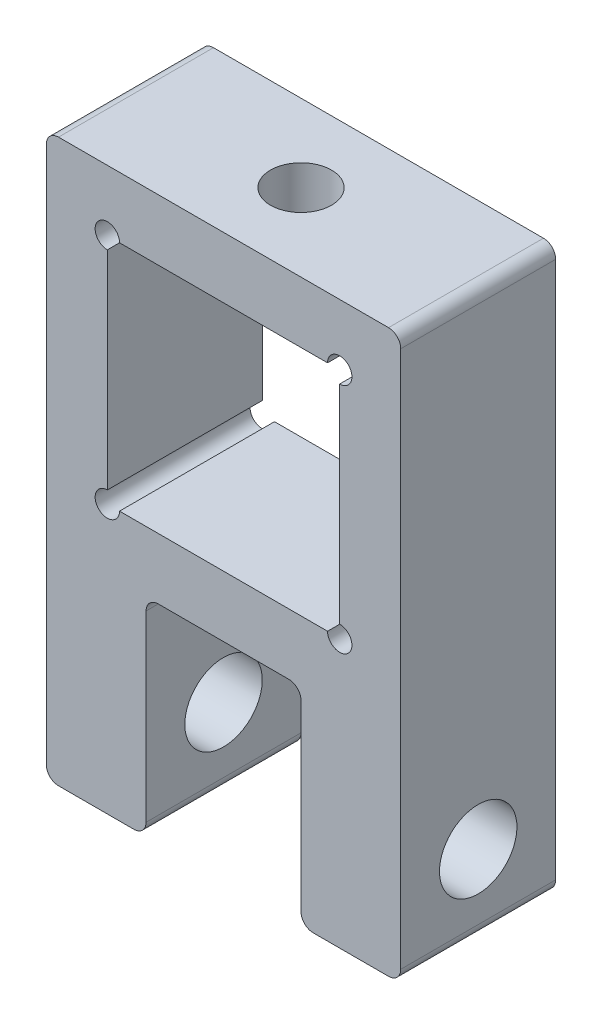
ISO-10303-21;
HEADER;
FILE_DESCRIPTION(('STEP AP214'),'2;1');
FILE_NAME('part.step','',(''),(''),'','','');
FILE_SCHEMA(('AUTOMOTIVE_DESIGN { 1 0 10303 214 1 1 1 1 }'));
ENDSEC;
DATA;
#1=APPLICATION_CONTEXT('core data for automotive mechanical design processes');
#2=APPLICATION_PROTOCOL_DEFINITION('international standard','automotive_design',2000,#1);
#3=PRODUCT_CONTEXT('',#1,'mechanical');
#4=PRODUCT('Part','Part','',(#3));
#5=PRODUCT_RELATED_PRODUCT_CATEGORY('part','',(#4));
#6=PRODUCT_DEFINITION_FORMATION('','',#4);
#7=PRODUCT_DEFINITION_CONTEXT('part definition',#1,'design');
#8=PRODUCT_DEFINITION('design','',#6,#7);
#9=PRODUCT_DEFINITION_SHAPE('','',#8);
#10=(LENGTH_UNIT() NAMED_UNIT(*) SI_UNIT(.MILLI.,.METRE.));
#11=(NAMED_UNIT(*) PLANE_ANGLE_UNIT() SI_UNIT($,.RADIAN.));
#12=(NAMED_UNIT(*) SI_UNIT($,.STERADIAN.) SOLID_ANGLE_UNIT());
#13=UNCERTAINTY_MEASURE_WITH_UNIT(LENGTH_MEASURE(1.E-05),#10,'distance_accuracy_value','');
#14=(GEOMETRIC_REPRESENTATION_CONTEXT(3) GLOBAL_UNCERTAINTY_ASSIGNED_CONTEXT((#13)) GLOBAL_UNIT_ASSIGNED_CONTEXT((#10,
#11,#12)) REPRESENTATION_CONTEXT('',''));
#15=CARTESIAN_POINT('',(0.,0.,0.));
#16=DIRECTION('',(0.,0.,1.));
#17=DIRECTION('',(1.,0.,0.));
#18=AXIS2_PLACEMENT_3D('',#15,#16,#17);
#19=CARTESIAN_POINT('',(-9.525,22.,12.7));
#20=DIRECTION('',(0.,0.,-1.));
#21=DIRECTION('',(-1.,0.,0.));
#22=AXIS2_PLACEMENT_3D('',#19,#20,#21);
#23=CYLINDRICAL_SURFACE('',#22,1.);
#24=CARTESIAN_POINT('',(-9.525,22.,0.));
#25=DIRECTION('',(0.,0.,1.));
#26=DIRECTION('',(1.,0.,0.));
#27=AXIS2_PLACEMENT_3D('',#24,#25,#26);
#28=CIRCLE('',#27,1.);
#29=CARTESIAN_POINT('',(-9.525,23.,0.));
#30=VERTEX_POINT('',#29);
#31=CARTESIAN_POINT('',(-8.525,22.,0.));
#32=VERTEX_POINT('',#31);
#33=EDGE_CURVE('E203',#30,#32,#28,.T.);
#34=ORIENTED_EDGE('',*,*,#33,.F.);
#35=DIRECTION('',(0.,0.,-1.));
#36=VECTOR('',#35,1.);
#37=CARTESIAN_POINT('',(-9.525,23.,12.7));
#38=LINE('',#37,#36);
#39=CARTESIAN_POINT('',(-9.525,23.,12.7));
#40=VERTEX_POINT('',#39);
#41=EDGE_CURVE('E198',#40,#30,#38,.T.);
#42=ORIENTED_EDGE('',*,*,#41,.F.);
#43=CARTESIAN_POINT('',(-9.525,22.,12.7));
#44=DIRECTION('',(0.,0.,1.));
#45=DIRECTION('',(1.,0.,0.));
#46=AXIS2_PLACEMENT_3D('',#43,#44,#45);
#47=CIRCLE('',#46,1.);
#48=CARTESIAN_POINT('',(-8.525,22.,12.7));
#49=VERTEX_POINT('',#48);
#50=EDGE_CURVE('E201',#40,#49,#47,.T.);
#51=ORIENTED_EDGE('',*,*,#50,.T.);
#52=DIRECTION('',(0.,0.,-1.));
#53=VECTOR('',#52,1.);
#54=CARTESIAN_POINT('',(-8.525,22.,12.7));
#55=LINE('',#54,#53);
#56=EDGE_CURVE('E241',#49,#32,#55,.T.);
#57=ORIENTED_EDGE('',*,*,#56,.T.);
#58=EDGE_LOOP('',(#34,#42,#51,#57));
#59=FACE_BOUND('',#58,.T.);
#60=ADVANCED_FACE('F36',(#59),#23,.F.);
#61=CARTESIAN_POINT('',(-9.525,0.,12.7));
#62=DIRECTION('',(-1.,0.,0.));
#63=DIRECTION('',(0.,0.,1.));
#64=AXIS2_PLACEMENT_3D('',#61,#62,#63);
#65=PLANE('',#64);
#66=DIRECTION('',(0.,1.,0.));
#67=VECTOR('',#66,1.);
#68=CARTESIAN_POINT('',(-9.525,0.,0.));
#69=LINE('',#68,#67);
#70=CARTESIAN_POINT('',(-9.525,40.05,0.));
#71=VERTEX_POINT('',#70);
#72=EDGE_CURVE('E268',#30,#71,#69,.T.);
#73=ORIENTED_EDGE('',*,*,#72,.T.);
#74=DIRECTION('',(0.,0.,-1.));
#75=VECTOR('',#74,1.);
#76=CARTESIAN_POINT('',(-9.525,40.05,12.7));
#77=LINE('',#76,#75);
#78=CARTESIAN_POINT('',(-9.525,40.05,12.7));
#79=VERTEX_POINT('',#78);
#80=EDGE_CURVE('E208',#79,#71,#77,.T.);
#81=ORIENTED_EDGE('',*,*,#80,.F.);
#82=DIRECTION('',(0.,1.,0.));
#83=VECTOR('',#82,1.);
#84=CARTESIAN_POINT('',(-9.525,0.,12.7));
#85=LINE('',#84,#83);
#86=EDGE_CURVE('E211',#40,#79,#85,.T.);
#87=ORIENTED_EDGE('',*,*,#86,.F.);
#88=ORIENTED_EDGE('',*,*,#41,.T.);
#89=EDGE_LOOP('',(#73,#81,#87,#88));
#90=FACE_BOUND('',#89,.T.);
#91=ADVANCED_FACE('F212',(#90),#65,.F.);
#92=CARTESIAN_POINT('',(-9.525,41.05,12.7));
#93=DIRECTION('',(0.,0.,-1.));
#94=DIRECTION('',(-1.,0.,0.));
#95=AXIS2_PLACEMENT_3D('',#92,#93,#94);
#96=CYLINDRICAL_SURFACE('',#95,1.);
#97=CARTESIAN_POINT('',(-9.525,41.05,0.));
#98=DIRECTION('',(0.,0.,1.));
#99=DIRECTION('',(1.,0.,0.));
#100=AXIS2_PLACEMENT_3D('',#97,#98,#99);
#101=CIRCLE('',#100,1.);
#102=CARTESIAN_POINT('',(-8.525,41.05,0.));
#103=VERTEX_POINT('',#102);
#104=EDGE_CURVE('E270',#103,#71,#101,.T.);
#105=ORIENTED_EDGE('',*,*,#104,.F.);
#106=DIRECTION('',(0.,0.,-1.));
#107=VECTOR('',#106,1.);
#108=CARTESIAN_POINT('',(-8.525,41.05,12.7));
#109=LINE('',#108,#107);
#110=CARTESIAN_POINT('',(-8.525,41.05,12.7));
#111=VERTEX_POINT('',#110);
#112=EDGE_CURVE('E300',#111,#103,#109,.T.);
#113=ORIENTED_EDGE('',*,*,#112,.F.);
#114=CARTESIAN_POINT('',(-9.525,41.05,12.7));
#115=DIRECTION('',(0.,0.,1.));
#116=DIRECTION('',(1.,0.,0.));
#117=AXIS2_PLACEMENT_3D('',#114,#115,#116);
#118=CIRCLE('',#117,1.);
#119=EDGE_CURVE('E216',#111,#79,#118,.T.);
#120=ORIENTED_EDGE('',*,*,#119,.T.);
#121=ORIENTED_EDGE('',*,*,#80,.T.);
#122=EDGE_LOOP('',(#105,#113,#120,#121));
#123=FACE_BOUND('',#122,.T.);
#124=ADVANCED_FACE('F427',(#123),#96,.F.);
#125=CARTESIAN_POINT('',(0.,41.05,12.7));
#126=DIRECTION('',(0.,1.,0.));
#127=DIRECTION('',(0.,0.,1.));
#128=AXIS2_PLACEMENT_3D('',#125,#126,#127);
#129=PLANE('',#128);
#130=CARTESIAN_POINT('',(0.,41.05,6.35));
#131=DIRECTION('',(0.,1.,0.));
#132=DIRECTION('',(0.,0.,1.));
#133=AXIS2_PLACEMENT_3D('',#130,#131,#132);
#134=CIRCLE('',#133,2.5);
#135=CARTESIAN_POINT('',(0.,41.05,8.85));
#136=VERTEX_POINT('',#135);
#137=EDGE_CURVE('E414',#136,#136,#134,.F.);
#138=ORIENTED_EDGE('',*,*,#137,.F.);
#139=EDGE_LOOP('',(#138));
#140=FACE_BOUND('',#139,.T.);
#141=DIRECTION('',(1.,0.,0.));
#142=VECTOR('',#141,1.);
#143=CARTESIAN_POINT('',(0.,41.05,0.));
#144=LINE('',#143,#142);
#145=CARTESIAN_POINT('',(8.525,41.05,0.));
#146=VERTEX_POINT('',#145);
#147=EDGE_CURVE('E273',#103,#146,#144,.T.);
#148=ORIENTED_EDGE('',*,*,#147,.T.);
#149=DIRECTION('',(0.,0.,-1.));
#150=VECTOR('',#149,1.);
#151=CARTESIAN_POINT('',(8.525,41.05,12.7));
#152=LINE('',#151,#150);
#153=CARTESIAN_POINT('',(8.525,41.05,12.7));
#154=VERTEX_POINT('',#153);
#155=EDGE_CURVE('E297',#154,#146,#152,.T.);
#156=ORIENTED_EDGE('',*,*,#155,.F.);
#157=DIRECTION('',(1.,0.,0.));
#158=VECTOR('',#157,1.);
#159=CARTESIAN_POINT('',(0.,41.05,12.7));
#160=LINE('',#159,#158);
#161=EDGE_CURVE('E230',#111,#154,#160,.T.);
#162=ORIENTED_EDGE('',*,*,#161,.F.);
#163=ORIENTED_EDGE('',*,*,#112,.T.);
#164=EDGE_LOOP('',(#148,#156,#162,#163));
#165=FACE_BOUND('',#164,.T.);
#166=ADVANCED_FACE('F423',(#140,#165),#129,.F.);
#167=CARTESIAN_POINT('',(9.525,41.05,12.7));
#168=DIRECTION('',(0.,0.,-1.));
#169=DIRECTION('',(-1.,0.,0.));
#170=AXIS2_PLACEMENT_3D('',#167,#168,#169);
#171=CYLINDRICAL_SURFACE('',#170,1.);
#172=CARTESIAN_POINT('',(9.525,41.05,0.));
#173=DIRECTION('',(0.,0.,1.));
#174=DIRECTION('',(1.,0.,0.));
#175=AXIS2_PLACEMENT_3D('',#172,#173,#174);
#176=CIRCLE('',#175,1.);
#177=CARTESIAN_POINT('',(9.525,40.05,0.));
#178=VERTEX_POINT('',#177);
#179=EDGE_CURVE('E276',#146,#178,#176,.F.);
#180=ORIENTED_EDGE('',*,*,#179,.T.);
#181=DIRECTION('',(0.,0.,-1.));
#182=VECTOR('',#181,1.);
#183=CARTESIAN_POINT('',(9.525,40.05,12.7));
#184=LINE('',#183,#182);
#185=CARTESIAN_POINT('',(9.525,40.05,12.7));
#186=VERTEX_POINT('',#185);
#187=EDGE_CURVE('E295',#186,#178,#184,.T.);
#188=ORIENTED_EDGE('',*,*,#187,.F.);
#189=CARTESIAN_POINT('',(9.525,41.05,12.7));
#190=DIRECTION('',(0.,0.,1.));
#191=DIRECTION('',(1.,0.,0.));
#192=AXIS2_PLACEMENT_3D('',#189,#190,#191);
#193=CIRCLE('',#192,1.);
#194=EDGE_CURVE('E233',#154,#186,#193,.F.);
#195=ORIENTED_EDGE('',*,*,#194,.F.);
#196=ORIENTED_EDGE('',*,*,#155,.T.);
#197=EDGE_LOOP('',(#180,#188,#195,#196));
#198=FACE_BOUND('',#197,.T.);
#199=ADVANCED_FACE('F426',(#198),#171,.F.);
#200=CARTESIAN_POINT('',(9.525,0.,12.7));
#201=DIRECTION('',(-1.,0.,0.));
#202=DIRECTION('',(0.,0.,1.));
#203=AXIS2_PLACEMENT_3D('',#200,#201,#202);
#204=PLANE('',#203);
#205=DIRECTION('',(0.,1.,0.));
#206=VECTOR('',#205,1.);
#207=CARTESIAN_POINT('',(9.525,0.,0.));
#208=LINE('',#207,#206);
#209=CARTESIAN_POINT('',(9.525,23.,0.));
#210=VERTEX_POINT('',#209);
#211=EDGE_CURVE('E279',#210,#178,#208,.T.);
#212=ORIENTED_EDGE('',*,*,#211,.F.);
#213=DIRECTION('',(0.,0.,-1.));
#214=VECTOR('',#213,1.);
#215=CARTESIAN_POINT('',(9.525,23.,12.7));
#216=LINE('',#215,#214);
#217=CARTESIAN_POINT('',(9.525,23.,12.7));
#218=VERTEX_POINT('',#217);
#219=EDGE_CURVE('E293',#218,#210,#216,.T.);
#220=ORIENTED_EDGE('',*,*,#219,.F.);
#221=DIRECTION('',(0.,1.,0.));
#222=VECTOR('',#221,1.);
#223=CARTESIAN_POINT('',(9.525,0.,12.7));
#224=LINE('',#223,#222);
#225=EDGE_CURVE('E235',#218,#186,#224,.T.);
#226=ORIENTED_EDGE('',*,*,#225,.T.);
#227=ORIENTED_EDGE('',*,*,#187,.T.);
#228=EDGE_LOOP('',(#212,#220,#226,#227));
#229=FACE_BOUND('',#228,.T.);
#230=ADVANCED_FACE('F444',(#229),#204,.T.);
#231=CARTESIAN_POINT('',(9.525,22.,12.7));
#232=DIRECTION('',(0.,0.,-1.));
#233=DIRECTION('',(-1.,0.,0.));
#234=AXIS2_PLACEMENT_3D('',#231,#232,#233);
#235=CYLINDRICAL_SURFACE('',#234,1.);
#236=CARTESIAN_POINT('',(9.525,22.,0.));
#237=DIRECTION('',(0.,0.,1.));
#238=DIRECTION('',(1.,0.,0.));
#239=AXIS2_PLACEMENT_3D('',#236,#237,#238);
#240=CIRCLE('',#239,1.);
#241=CARTESIAN_POINT('',(8.525,22.,0.));
#242=VERTEX_POINT('',#241);
#243=EDGE_CURVE('E282',#210,#242,#240,.F.);
#244=ORIENTED_EDGE('',*,*,#243,.T.);
#245=DIRECTION('',(0.,0.,-1.));
#246=VECTOR('',#245,1.);
#247=CARTESIAN_POINT('',(8.525,22.,12.7));
#248=LINE('',#247,#246);
#249=CARTESIAN_POINT('',(8.525,22.,12.7));
#250=VERTEX_POINT('',#249);
#251=EDGE_CURVE('E290',#250,#242,#248,.T.);
#252=ORIENTED_EDGE('',*,*,#251,.F.);
#253=CARTESIAN_POINT('',(9.525,22.,12.7));
#254=DIRECTION('',(0.,0.,1.));
#255=DIRECTION('',(1.,0.,0.));
#256=AXIS2_PLACEMENT_3D('',#253,#254,#255);
#257=CIRCLE('',#256,1.);
#258=EDGE_CURVE('E238',#218,#250,#257,.F.);
#259=ORIENTED_EDGE('',*,*,#258,.F.);
#260=ORIENTED_EDGE('',*,*,#219,.T.);
#261=EDGE_LOOP('',(#244,#252,#259,#260));
#262=FACE_BOUND('',#261,.T.);
#263=ADVANCED_FACE('F441',(#262),#235,.F.);
#264=CARTESIAN_POINT('',(14.525,0.,12.7));
#265=DIRECTION('',(1.,0.,0.));
#266=DIRECTION('',(0.,1.,0.));
#267=AXIS2_PLACEMENT_3D('',#264,#265,#266);
#268=PLANE('',#267);
#269=CARTESIAN_POINT('',(14.525,6.35,6.35));
#270=DIRECTION('',(1.,0.,0.));
#271=DIRECTION('',(0.,1.,0.));
#272=AXIS2_PLACEMENT_3D('',#269,#270,#271);
#273=CIRCLE('',#272,3.175);
#274=CARTESIAN_POINT('',(14.525,9.525,6.35));
#275=VERTEX_POINT('',#274);
#276=EDGE_CURVE('E411',#275,#275,#273,.T.);
#277=ORIENTED_EDGE('',*,*,#276,.F.);
#278=EDGE_LOOP('',(#277));
#279=FACE_BOUND('',#278,.T.);
#280=DIRECTION('',(0.,-1.,0.));
#281=VECTOR('',#280,1.);
#282=CARTESIAN_POINT('',(14.525,0.,12.7));
#283=LINE('',#282,#281);
#284=CARTESIAN_POINT('',(14.525,45.05,12.7));
#285=VERTEX_POINT('',#284);
#286=CARTESIAN_POINT('',(14.525,1.,12.7));
#287=VERTEX_POINT('',#286);
#288=EDGE_CURVE('E288',#285,#287,#283,.T.);
#289=ORIENTED_EDGE('',*,*,#288,.T.);
#290=DIRECTION('',(0.,0.,-1.));
#291=VECTOR('',#290,1.);
#292=CARTESIAN_POINT('',(14.525,1.,12.7));
#293=LINE('',#292,#291);
#294=CARTESIAN_POINT('',(14.525,1.,0.));
#295=VERTEX_POINT('',#294);
#296=EDGE_CURVE('E308',#287,#295,#293,.T.);
#297=ORIENTED_EDGE('',*,*,#296,.T.);
#298=DIRECTION('',(0.,-1.,0.));
#299=VECTOR('',#298,1.);
#300=CARTESIAN_POINT('',(14.525,0.,0.));
#301=LINE('',#300,#299);
#302=CARTESIAN_POINT('',(14.525,45.05,0.));
#303=VERTEX_POINT('',#302);
#304=EDGE_CURVE('E242',#303,#295,#301,.T.);
#305=ORIENTED_EDGE('',*,*,#304,.F.);
#306=DIRECTION('',(0.,0.,-1.));
#307=VECTOR('',#306,1.);
#308=CARTESIAN_POINT('',(14.525,45.05,12.7));
#309=LINE('',#308,#307);
#310=EDGE_CURVE('E207',#303,#285,#309,.F.);
#311=ORIENTED_EDGE('',*,*,#310,.T.);
#312=EDGE_LOOP('',(#289,#297,#305,#311));
#313=FACE_BOUND('',#312,.T.);
#314=ADVANCED_FACE('F485',(#279,#313),#268,.T.);
#315=CARTESIAN_POINT('',(0.,46.05,12.7));
#316=DIRECTION('',(0.,-1.,0.));
#317=DIRECTION('',(0.,0.,-1.));
#318=AXIS2_PLACEMENT_3D('',#315,#316,#317);
#319=PLANE('',#318);
#320=CARTESIAN_POINT('',(0.,46.05,6.35));
#321=DIRECTION('',(0.,1.,0.));
#322=DIRECTION('',(0.,0.,1.));
#323=AXIS2_PLACEMENT_3D('',#320,#321,#322);
#324=CIRCLE('',#323,2.5);
#325=CARTESIAN_POINT('',(0.,46.05,8.85));
#326=VERTEX_POINT('',#325);
#327=EDGE_CURVE('E415',#326,#326,#324,.T.);
#328=ORIENTED_EDGE('',*,*,#327,.F.);
#329=EDGE_LOOP('',(#328));
#330=FACE_BOUND('',#329,.T.);
#331=DIRECTION('',(-1.,0.,0.));
#332=VECTOR('',#331,1.);
#333=CARTESIAN_POINT('',(0.,46.05,0.));
#334=LINE('',#333,#332);
#335=CARTESIAN_POINT('',(13.525,46.05,0.));
#336=VERTEX_POINT('',#335);
#337=CARTESIAN_POINT('',(-13.525,46.05,0.));
#338=VERTEX_POINT('',#337);
#339=EDGE_CURVE('E245',#336,#338,#334,.T.);
#340=ORIENTED_EDGE('',*,*,#339,.T.);
#341=DIRECTION('',(0.,0.,-1.));
#342=VECTOR('',#341,1.);
#343=CARTESIAN_POINT('',(-13.525,46.05,12.7));
#344=LINE('',#343,#342);
#345=CARTESIAN_POINT('',(-13.525,46.05,12.7));
#346=VERTEX_POINT('',#345);
#347=EDGE_CURVE('E348',#338,#346,#344,.F.);
#348=ORIENTED_EDGE('',*,*,#347,.T.);
#349=DIRECTION('',(-1.,0.,0.));
#350=VECTOR('',#349,1.);
#351=CARTESIAN_POINT('',(0.,46.05,12.7));
#352=LINE('',#351,#350);
#353=CARTESIAN_POINT('',(13.525,46.05,12.7));
#354=VERTEX_POINT('',#353);
#355=EDGE_CURVE('E402',#354,#346,#352,.T.);
#356=ORIENTED_EDGE('',*,*,#355,.F.);
#357=DIRECTION('',(0.,0.,-1.));
#358=VECTOR('',#357,1.);
#359=CARTESIAN_POINT('',(13.525,46.05,0.));
#360=LINE('',#359,#358);
#361=EDGE_CURVE('E345',#354,#336,#360,.T.);
#362=ORIENTED_EDGE('',*,*,#361,.T.);
#363=EDGE_LOOP('',(#340,#348,#356,#362));
#364=FACE_BOUND('',#363,.T.);
#365=ADVANCED_FACE('F481',(#330,#364),#319,.F.);
#366=CARTESIAN_POINT('',(-14.525,0.,12.7));
#367=DIRECTION('',(1.,0.,0.));
#368=DIRECTION('',(0.,1.,0.));
#369=AXIS2_PLACEMENT_3D('',#366,#367,#368);
#370=PLANE('',#369);
#371=CARTESIAN_POINT('',(-14.525,6.35,6.35));
#372=DIRECTION('',(1.,0.,0.));
#373=DIRECTION('',(0.,1.,0.));
#374=AXIS2_PLACEMENT_3D('',#371,#372,#373);
#375=CIRCLE('',#374,3.175);
#376=CARTESIAN_POINT('',(-14.525,9.525,6.35));
#377=VERTEX_POINT('',#376);
#378=EDGE_CURVE('E306',#377,#377,#375,.T.);
#379=ORIENTED_EDGE('',*,*,#378,.T.);
#380=EDGE_LOOP('',(#379));
#381=FACE_BOUND('',#380,.T.);
#382=DIRECTION('',(0.,-1.,0.));
#383=VECTOR('',#382,1.);
#384=CARTESIAN_POINT('',(-14.525,0.,12.7));
#385=LINE('',#384,#383);
#386=CARTESIAN_POINT('',(-14.525,45.05,12.7));
#387=VERTEX_POINT('',#386);
#388=CARTESIAN_POINT('',(-14.525,1.,12.7));
#389=VERTEX_POINT('',#388);
#390=EDGE_CURVE('E399',#387,#389,#385,.T.);
#391=ORIENTED_EDGE('',*,*,#390,.F.);
#392=DIRECTION('',(0.,0.,-1.));
#393=VECTOR('',#392,1.);
#394=CARTESIAN_POINT('',(-14.525,45.05,12.7));
#395=LINE('',#394,#393);
#396=CARTESIAN_POINT('',(-14.525,45.05,0.));
#397=VERTEX_POINT('',#396);
#398=EDGE_CURVE('E342',#387,#397,#395,.T.);
#399=ORIENTED_EDGE('',*,*,#398,.T.);
#400=DIRECTION('',(0.,-1.,0.));
#401=VECTOR('',#400,1.);
#402=CARTESIAN_POINT('',(-14.525,0.,0.));
#403=LINE('',#402,#401);
#404=CARTESIAN_POINT('',(-14.525,1.,0.));
#405=VERTEX_POINT('',#404);
#406=EDGE_CURVE('E249',#397,#405,#403,.T.);
#407=ORIENTED_EDGE('',*,*,#406,.T.);
#408=DIRECTION('',(0.,0.,-1.));
#409=VECTOR('',#408,1.);
#410=CARTESIAN_POINT('',(-14.525,1.,12.7));
#411=LINE('',#410,#409);
#412=EDGE_CURVE('E340',#405,#389,#411,.F.);
#413=ORIENTED_EDGE('',*,*,#412,.T.);
#414=EDGE_LOOP('',(#391,#399,#407,#413));
#415=FACE_BOUND('',#414,.T.);
#416=ADVANCED_FACE('F477',(#381,#415),#370,.F.);
#417=CARTESIAN_POINT('',(0.,0.,12.7));
#418=DIRECTION('',(0.,1.,0.));
#419=DIRECTION('',(0.,0.,1.));
#420=AXIS2_PLACEMENT_3D('',#417,#418,#419);
#421=PLANE('',#420);
#422=DIRECTION('',(1.,0.,0.));
#423=VECTOR('',#422,1.);
#424=CARTESIAN_POINT('',(0.,0.,12.7));
#425=LINE('',#424,#423);
#426=CARTESIAN_POINT('',(-13.525,0.,12.7));
#427=VERTEX_POINT('',#426);
#428=CARTESIAN_POINT('',(-7.35,0.,12.7));
#429=VERTEX_POINT('',#428);
#430=EDGE_CURVE('E394',#427,#429,#425,.T.);
#431=ORIENTED_EDGE('',*,*,#430,.F.);
#432=DIRECTION('',(0.,0.,-1.));
#433=VECTOR('',#432,1.);
#434=CARTESIAN_POINT('',(-13.525,0.,12.7));
#435=LINE('',#434,#433);
#436=CARTESIAN_POINT('',(-13.525,0.,0.));
#437=VERTEX_POINT('',#436);
#438=EDGE_CURVE('E352',#427,#437,#435,.T.);
#439=ORIENTED_EDGE('',*,*,#438,.T.);
#440=DIRECTION('',(1.,0.,0.));
#441=VECTOR('',#440,1.);
#442=CARTESIAN_POINT('',(0.,0.,0.));
#443=LINE('',#442,#441);
#444=CARTESIAN_POINT('',(-7.35,0.,0.));
#445=VERTEX_POINT('',#444);
#446=EDGE_CURVE('E252',#437,#445,#443,.T.);
#447=ORIENTED_EDGE('',*,*,#446,.T.);
#448=DIRECTION('',(0.,0.,-1.));
#449=VECTOR('',#448,1.);
#450=CARTESIAN_POINT('',(-7.35,0.,12.7));
#451=LINE('',#450,#449);
#452=EDGE_CURVE('E350',#445,#429,#451,.F.);
#453=ORIENTED_EDGE('',*,*,#452,.T.);
#454=EDGE_LOOP('',(#431,#439,#447,#453));
#455=FACE_BOUND('',#454,.T.);
#456=ADVANCED_FACE('F473',(#455),#421,.F.);
#457=CARTESIAN_POINT('',(-6.35,0.,12.7));
#458=DIRECTION('',(-1.,0.,0.));
#459=DIRECTION('',(0.,0.,1.));
#460=AXIS2_PLACEMENT_3D('',#457,#458,#459);
#461=PLANE('',#460);
#462=CARTESIAN_POINT('',(-6.35,6.35,6.35));
#463=DIRECTION('',(-1.,0.,0.));
#464=DIRECTION('',(0.,0.,1.));
#465=AXIS2_PLACEMENT_3D('',#462,#463,#464);
#466=CIRCLE('',#465,3.175);
#467=CARTESIAN_POINT('',(-6.35,6.35,9.525));
#468=VERTEX_POINT('',#467);
#469=EDGE_CURVE('E246',#468,#468,#466,.T.);
#470=ORIENTED_EDGE('',*,*,#469,.T.);
#471=EDGE_LOOP('',(#470));
#472=FACE_BOUND('',#471,.T.);
#473=DIRECTION('',(0.,1.,0.));
#474=VECTOR('',#473,1.);
#475=CARTESIAN_POINT('',(-6.35,0.,12.7));
#476=LINE('',#475,#474);
#477=CARTESIAN_POINT('',(-6.35,1.,12.7));
#478=VERTEX_POINT('',#477);
#479=CARTESIAN_POINT('',(-6.35,16.,12.7));
#480=VERTEX_POINT('',#479);
#481=EDGE_CURVE('E389',#478,#480,#476,.T.);
#482=ORIENTED_EDGE('',*,*,#481,.F.);
#483=DIRECTION('',(0.,0.,-1.));
#484=VECTOR('',#483,1.);
#485=CARTESIAN_POINT('',(-6.35,1.,12.7));
#486=LINE('',#485,#484);
#487=CARTESIAN_POINT('',(-6.35,1.,0.));
#488=VERTEX_POINT('',#487);
#489=EDGE_CURVE('E357',#478,#488,#486,.T.);
#490=ORIENTED_EDGE('',*,*,#489,.T.);
#491=DIRECTION('',(0.,1.,0.));
#492=VECTOR('',#491,1.);
#493=CARTESIAN_POINT('',(-6.35,0.,0.));
#494=LINE('',#493,#492);
#495=CARTESIAN_POINT('',(-6.35,16.,0.));
#496=VERTEX_POINT('',#495);
#497=EDGE_CURVE('E255',#488,#496,#494,.T.);
#498=ORIENTED_EDGE('',*,*,#497,.T.);
#499=DIRECTION('',(0.,0.,-1.));
#500=VECTOR('',#499,1.);
#501=CARTESIAN_POINT('',(-6.35,16.,12.7));
#502=LINE('',#501,#500);
#503=EDGE_CURVE('E355',#496,#480,#502,.F.);
#504=ORIENTED_EDGE('',*,*,#503,.T.);
#505=EDGE_LOOP('',(#482,#490,#498,#504));
#506=FACE_BOUND('',#505,.T.);
#507=ADVANCED_FACE('F381',(#472,#506),#461,.F.);
#508=CARTESIAN_POINT('',(0.,17.,12.7));
#509=DIRECTION('',(0.,1.,0.));
#510=DIRECTION('',(0.,0.,1.));
#511=AXIS2_PLACEMENT_3D('',#508,#509,#510);
#512=PLANE('',#511);
#513=DIRECTION('',(1.,0.,0.));
#514=VECTOR('',#513,1.);
#515=CARTESIAN_POINT('',(0.,17.,0.));
#516=LINE('',#515,#514);
#517=CARTESIAN_POINT('',(-5.35,17.,0.));
#518=VERTEX_POINT('',#517);
#519=CARTESIAN_POINT('',(5.35,17.,0.));
#520=VERTEX_POINT('',#519);
#521=EDGE_CURVE('E258',#518,#520,#516,.T.);
#522=ORIENTED_EDGE('',*,*,#521,.T.);
#523=DIRECTION('',(0.,0.,-1.));
#524=VECTOR('',#523,1.);
#525=CARTESIAN_POINT('',(5.35,17.,12.7));
#526=LINE('',#525,#524);
#527=CARTESIAN_POINT('',(5.35,17.,12.7));
#528=VERTEX_POINT('',#527);
#529=EDGE_CURVE('E367',#520,#528,#526,.F.);
#530=ORIENTED_EDGE('',*,*,#529,.T.);
#531=DIRECTION('',(1.,0.,0.));
#532=VECTOR('',#531,1.);
#533=CARTESIAN_POINT('',(0.,17.,12.7));
#534=LINE('',#533,#532);
#535=CARTESIAN_POINT('',(-5.35,17.,12.7));
#536=VERTEX_POINT('',#535);
#537=EDGE_CURVE('E388',#536,#528,#534,.T.);
#538=ORIENTED_EDGE('',*,*,#537,.F.);
#539=DIRECTION('',(0.,0.,-1.));
#540=VECTOR('',#539,1.);
#541=CARTESIAN_POINT('',(-5.35,17.,0.));
#542=LINE('',#541,#540);
#543=EDGE_CURVE('E364',#536,#518,#542,.T.);
#544=ORIENTED_EDGE('',*,*,#543,.T.);
#545=EDGE_LOOP('',(#522,#530,#538,#544));
#546=FACE_BOUND('',#545,.T.);
#547=ADVANCED_FACE('F391',(#546),#512,.F.);
#548=CARTESIAN_POINT('',(6.35,0.,12.7));
#549=DIRECTION('',(-1.,0.,0.));
#550=DIRECTION('',(0.,0.,1.));
#551=AXIS2_PLACEMENT_3D('',#548,#549,#550);
#552=PLANE('',#551);
#553=CARTESIAN_POINT('',(6.35,6.35,6.35));
#554=DIRECTION('',(-1.,0.,0.));
#555=DIRECTION('',(0.,0.,1.));
#556=AXIS2_PLACEMENT_3D('',#553,#554,#555);
#557=CIRCLE('',#556,3.175);
#558=CARTESIAN_POINT('',(6.35,6.35,9.525));
#559=VERTEX_POINT('',#558);
#560=EDGE_CURVE('E303',#559,#559,#557,.T.);
#561=ORIENTED_EDGE('',*,*,#560,.F.);
#562=EDGE_LOOP('',(#561));
#563=FACE_BOUND('',#562,.T.);
#564=DIRECTION('',(0.,1.,0.));
#565=VECTOR('',#564,1.);
#566=CARTESIAN_POINT('',(6.35,0.,0.));
#567=LINE('',#566,#565);
#568=CARTESIAN_POINT('',(6.35,1.,0.));
#569=VERTEX_POINT('',#568);
#570=CARTESIAN_POINT('',(6.35,16.,0.));
#571=VERTEX_POINT('',#570);
#572=EDGE_CURVE('E261',#569,#571,#567,.T.);
#573=ORIENTED_EDGE('',*,*,#572,.F.);
#574=DIRECTION('',(0.,0.,-1.));
#575=VECTOR('',#574,1.);
#576=CARTESIAN_POINT('',(6.35,1.,12.7));
#577=LINE('',#576,#575);
#578=CARTESIAN_POINT('',(6.35,1.,12.7));
#579=VERTEX_POINT('',#578);
#580=EDGE_CURVE('E58',#569,#579,#577,.F.);
#581=ORIENTED_EDGE('',*,*,#580,.T.);
#582=DIRECTION('',(0.,1.,0.));
#583=VECTOR('',#582,1.);
#584=CARTESIAN_POINT('',(6.35,0.,12.7));
#585=LINE('',#584,#583);
#586=CARTESIAN_POINT('',(6.35,16.,12.7));
#587=VERTEX_POINT('',#586);
#588=EDGE_CURVE('E225',#579,#587,#585,.T.);
#589=ORIENTED_EDGE('',*,*,#588,.T.);
#590=DIRECTION('',(0.,0.,-1.));
#591=VECTOR('',#590,1.);
#592=CARTESIAN_POINT('',(6.35,16.,12.7));
#593=LINE('',#592,#591);
#594=EDGE_CURVE('E360',#587,#571,#593,.T.);
#595=ORIENTED_EDGE('',*,*,#594,.T.);
#596=EDGE_LOOP('',(#573,#581,#589,#595));
#597=FACE_BOUND('',#596,.T.);
#598=ADVANCED_FACE('F464',(#563,#597),#552,.T.);
#599=CARTESIAN_POINT('',(0.,0.,12.7));
#600=DIRECTION('',(0.,-1.,0.));
#601=DIRECTION('',(0.,0.,-1.));
#602=AXIS2_PLACEMENT_3D('',#599,#600,#601);
#603=PLANE('',#602);
#604=DIRECTION('',(-1.,0.,0.));
#605=VECTOR('',#604,1.);
#606=CARTESIAN_POINT('',(0.,0.,0.));
#607=LINE('',#606,#605);
#608=CARTESIAN_POINT('',(13.525,0.,0.));
#609=VERTEX_POINT('',#608);
#610=CARTESIAN_POINT('',(7.35,0.,0.));
#611=VERTEX_POINT('',#610);
#612=EDGE_CURVE('E264',#609,#611,#607,.T.);
#613=ORIENTED_EDGE('',*,*,#612,.F.);
#614=DIRECTION('',(0.,0.,-1.));
#615=VECTOR('',#614,1.);
#616=CARTESIAN_POINT('',(13.525,0.,12.7));
#617=LINE('',#616,#615);
#618=CARTESIAN_POINT('',(13.525,0.,12.7));
#619=VERTEX_POINT('',#618);
#620=EDGE_CURVE('E326',#609,#619,#617,.F.);
#621=ORIENTED_EDGE('',*,*,#620,.T.);
#622=DIRECTION('',(-1.,0.,0.));
#623=VECTOR('',#622,1.);
#624=CARTESIAN_POINT('',(0.,0.,12.7));
#625=LINE('',#624,#623);
#626=CARTESIAN_POINT('',(7.35,0.,12.7));
#627=VERTEX_POINT('',#626);
#628=EDGE_CURVE('E222',#619,#627,#625,.T.);
#629=ORIENTED_EDGE('',*,*,#628,.T.);
#630=DIRECTION('',(0.,0.,-1.));
#631=VECTOR('',#630,1.);
#632=CARTESIAN_POINT('',(7.35,0.,12.7));
#633=LINE('',#632,#631);
#634=EDGE_CURVE('E323',#627,#611,#633,.T.);
#635=ORIENTED_EDGE('',*,*,#634,.T.);
#636=EDGE_LOOP('',(#613,#621,#629,#635));
#637=FACE_BOUND('',#636,.T.);
#638=ADVANCED_FACE('F461',(#637),#603,.T.);
#639=CARTESIAN_POINT('',(0.,22.,12.7));
#640=DIRECTION('',(0.,-1.,0.));
#641=DIRECTION('',(0.,0.,-1.));
#642=AXIS2_PLACEMENT_3D('',#639,#640,#641);
#643=PLANE('',#642);
#644=DIRECTION('',(-1.,0.,0.));
#645=VECTOR('',#644,1.);
#646=CARTESIAN_POINT('',(0.,22.,0.));
#647=LINE('',#646,#645);
#648=EDGE_CURVE('E285',#242,#32,#647,.T.);
#649=ORIENTED_EDGE('',*,*,#648,.T.);
#650=ORIENTED_EDGE('',*,*,#56,.F.);
#651=DIRECTION('',(-1.,0.,0.));
#652=VECTOR('',#651,1.);
#653=CARTESIAN_POINT('',(0.,22.,12.7));
#654=LINE('',#653,#652);
#655=EDGE_CURVE('E220',#250,#49,#654,.T.);
#656=ORIENTED_EDGE('',*,*,#655,.F.);
#657=ORIENTED_EDGE('',*,*,#251,.T.);
#658=EDGE_LOOP('',(#649,#650,#656,#657));
#659=FACE_BOUND('',#658,.T.);
#660=ADVANCED_FACE('F438',(#659),#643,.F.);
#661=CARTESIAN_POINT('',(0.,0.,12.7));
#662=DIRECTION('',(0.,0.,1.));
#663=DIRECTION('',(1.,0.,0.));
#664=AXIS2_PLACEMENT_3D('',#661,#662,#663);
#665=PLANE('',#664);
#666=ORIENTED_EDGE('',*,*,#628,.F.);
#667=CARTESIAN_POINT('',(13.525,1.,12.7));
#668=DIRECTION('',(0.,0.,1.));
#669=DIRECTION('',(1.,0.,0.));
#670=AXIS2_PLACEMENT_3D('',#667,#668,#669);
#671=CIRCLE('',#670,1.);
#672=EDGE_CURVE('E338',#619,#287,#671,.T.);
#673=ORIENTED_EDGE('',*,*,#672,.T.);
#674=ORIENTED_EDGE('',*,*,#288,.F.);
#675=CARTESIAN_POINT('',(13.525,45.05,12.7));
#676=DIRECTION('',(0.,0.,1.));
#677=DIRECTION('',(1.,0.,0.));
#678=AXIS2_PLACEMENT_3D('',#675,#676,#677);
#679=CIRCLE('',#678,1.);
#680=EDGE_CURVE('E328',#285,#354,#679,.T.);
#681=ORIENTED_EDGE('',*,*,#680,.T.);
#682=ORIENTED_EDGE('',*,*,#355,.T.);
#683=CARTESIAN_POINT('',(-13.525,45.05,12.7));
#684=DIRECTION('',(0.,0.,1.));
#685=DIRECTION('',(1.,0.,0.));
#686=AXIS2_PLACEMENT_3D('',#683,#684,#685);
#687=CIRCLE('',#686,1.);
#688=EDGE_CURVE('E336',#346,#387,#687,.T.);
#689=ORIENTED_EDGE('',*,*,#688,.T.);
#690=ORIENTED_EDGE('',*,*,#390,.T.);
#691=CARTESIAN_POINT('',(-13.525,1.,12.7));
#692=DIRECTION('',(0.,0.,1.));
#693=DIRECTION('',(1.,0.,0.));
#694=AXIS2_PLACEMENT_3D('',#691,#692,#693);
#695=CIRCLE('',#694,1.);
#696=EDGE_CURVE('E334',#389,#427,#695,.T.);
#697=ORIENTED_EDGE('',*,*,#696,.T.);
#698=ORIENTED_EDGE('',*,*,#430,.T.);
#699=CARTESIAN_POINT('',(-7.35,1.,12.7));
#700=DIRECTION('',(0.,0.,1.));
#701=DIRECTION('',(1.,0.,0.));
#702=AXIS2_PLACEMENT_3D('',#699,#700,#701);
#703=CIRCLE('',#702,1.);
#704=EDGE_CURVE('E332',#429,#478,#703,.T.);
#705=ORIENTED_EDGE('',*,*,#704,.T.);
#706=ORIENTED_EDGE('',*,*,#481,.T.);
#707=CARTESIAN_POINT('',(-5.35,16.,12.7));
#708=DIRECTION('',(0.,0.,1.));
#709=DIRECTION('',(1.,0.,0.));
#710=AXIS2_PLACEMENT_3D('',#707,#708,#709);
#711=CIRCLE('',#710,1.);
#712=EDGE_CURVE('E11',#480,#536,#711,.F.);
#713=ORIENTED_EDGE('',*,*,#712,.T.);
#714=ORIENTED_EDGE('',*,*,#537,.T.);
#715=CARTESIAN_POINT('',(5.35,16.,12.7));
#716=DIRECTION('',(0.,0.,1.));
#717=DIRECTION('',(1.,0.,0.));
#718=AXIS2_PLACEMENT_3D('',#715,#716,#717);
#719=CIRCLE('',#718,1.);
#720=EDGE_CURVE('E51',#528,#587,#719,.F.);
#721=ORIENTED_EDGE('',*,*,#720,.T.);
#722=ORIENTED_EDGE('',*,*,#588,.F.);
#723=CARTESIAN_POINT('',(7.35,1.,12.7));
#724=DIRECTION('',(0.,0.,1.));
#725=DIRECTION('',(1.,0.,0.));
#726=AXIS2_PLACEMENT_3D('',#723,#724,#725);
#727=CIRCLE('',#726,1.);
#728=EDGE_CURVE('E330',#579,#627,#727,.T.);
#729=ORIENTED_EDGE('',*,*,#728,.T.);
#730=EDGE_LOOP('',(#666,#673,#674,#681,#682,#689,#690,#697,#698,#705,#706,#713,#714,#721,#722,#729));
#731=FACE_BOUND('',#730,.T.);
#732=ORIENTED_EDGE('',*,*,#50,.F.);
#733=ORIENTED_EDGE('',*,*,#86,.T.);
#734=ORIENTED_EDGE('',*,*,#119,.F.);
#735=ORIENTED_EDGE('',*,*,#161,.T.);
#736=ORIENTED_EDGE('',*,*,#194,.T.);
#737=ORIENTED_EDGE('',*,*,#225,.F.);
#738=ORIENTED_EDGE('',*,*,#258,.T.);
#739=ORIENTED_EDGE('',*,*,#655,.T.);
#740=EDGE_LOOP('',(#732,#733,#734,#735,#736,#737,#738,#739));
#741=FACE_BOUND('',#740,.T.);
#742=ADVANCED_FACE('F218',(#731,#741),#665,.T.);
#743=CARTESIAN_POINT('',(0.,0.,0.));
#744=DIRECTION('',(0.,0.,1.));
#745=DIRECTION('',(1.,0.,0.));
#746=AXIS2_PLACEMENT_3D('',#743,#744,#745);
#747=PLANE('',#746);
#748=ORIENTED_EDGE('',*,*,#304,.T.);
#749=CARTESIAN_POINT('',(13.525,1.,0.));
#750=DIRECTION('',(0.,0.,1.));
#751=DIRECTION('',(1.,0.,0.));
#752=AXIS2_PLACEMENT_3D('',#749,#750,#751);
#753=CIRCLE('',#752,1.);
#754=EDGE_CURVE('E321',#295,#609,#753,.F.);
#755=ORIENTED_EDGE('',*,*,#754,.T.);
#756=ORIENTED_EDGE('',*,*,#612,.T.);
#757=CARTESIAN_POINT('',(7.35,1.,0.));
#758=DIRECTION('',(0.,0.,1.));
#759=DIRECTION('',(1.,0.,0.));
#760=AXIS2_PLACEMENT_3D('',#757,#758,#759);
#761=CIRCLE('',#760,1.);
#762=EDGE_CURVE('E313',#611,#569,#761,.F.);
#763=ORIENTED_EDGE('',*,*,#762,.T.);
#764=ORIENTED_EDGE('',*,*,#572,.T.);
#765=CARTESIAN_POINT('',(5.35,16.,0.));
#766=DIRECTION('',(0.,0.,1.));
#767=DIRECTION('',(1.,0.,0.));
#768=AXIS2_PLACEMENT_3D('',#765,#766,#767);
#769=CIRCLE('',#768,1.);
#770=EDGE_CURVE('E369',#571,#520,#769,.T.);
#771=ORIENTED_EDGE('',*,*,#770,.T.);
#772=ORIENTED_EDGE('',*,*,#521,.F.);
#773=CARTESIAN_POINT('',(-5.35,16.,0.));
#774=DIRECTION('',(0.,0.,1.));
#775=DIRECTION('',(1.,0.,0.));
#776=AXIS2_PLACEMENT_3D('',#773,#774,#775);
#777=CIRCLE('',#776,1.);
#778=EDGE_CURVE('E44',#518,#496,#777,.T.);
#779=ORIENTED_EDGE('',*,*,#778,.T.);
#780=ORIENTED_EDGE('',*,*,#497,.F.);
#781=CARTESIAN_POINT('',(-7.35,1.,0.));
#782=DIRECTION('',(0.,0.,1.));
#783=DIRECTION('',(1.,0.,0.));
#784=AXIS2_PLACEMENT_3D('',#781,#782,#783);
#785=CIRCLE('',#784,1.);
#786=EDGE_CURVE('E315',#488,#445,#785,.F.);
#787=ORIENTED_EDGE('',*,*,#786,.T.);
#788=ORIENTED_EDGE('',*,*,#446,.F.);
#789=CARTESIAN_POINT('',(-13.525,1.,0.));
#790=DIRECTION('',(0.,0.,1.));
#791=DIRECTION('',(1.,0.,0.));
#792=AXIS2_PLACEMENT_3D('',#789,#790,#791);
#793=CIRCLE('',#792,1.);
#794=EDGE_CURVE('E317',#437,#405,#793,.F.);
#795=ORIENTED_EDGE('',*,*,#794,.T.);
#796=ORIENTED_EDGE('',*,*,#406,.F.);
#797=CARTESIAN_POINT('',(-13.525,45.05,0.));
#798=DIRECTION('',(0.,0.,1.));
#799=DIRECTION('',(1.,0.,0.));
#800=AXIS2_PLACEMENT_3D('',#797,#798,#799);
#801=CIRCLE('',#800,1.);
#802=EDGE_CURVE('E319',#397,#338,#801,.F.);
#803=ORIENTED_EDGE('',*,*,#802,.T.);
#804=ORIENTED_EDGE('',*,*,#339,.F.);
#805=CARTESIAN_POINT('',(13.525,45.05,0.));
#806=DIRECTION('',(0.,0.,1.));
#807=DIRECTION('',(1.,0.,0.));
#808=AXIS2_PLACEMENT_3D('',#805,#806,#807);
#809=CIRCLE('',#808,1.);
#810=EDGE_CURVE('E311',#336,#303,#809,.F.);
#811=ORIENTED_EDGE('',*,*,#810,.T.);
#812=EDGE_LOOP('',(#748,#755,#756,#763,#764,#771,#772,#779,#780,#787,#788,#795,#796,#803,#804,#811));
#813=FACE_BOUND('',#812,.T.);
#814=ORIENTED_EDGE('',*,*,#33,.T.);
#815=ORIENTED_EDGE('',*,*,#648,.F.);
#816=ORIENTED_EDGE('',*,*,#243,.F.);
#817=ORIENTED_EDGE('',*,*,#211,.T.);
#818=ORIENTED_EDGE('',*,*,#179,.F.);
#819=ORIENTED_EDGE('',*,*,#147,.F.);
#820=ORIENTED_EDGE('',*,*,#104,.T.);
#821=ORIENTED_EDGE('',*,*,#72,.F.);
#822=EDGE_LOOP('',(#814,#815,#816,#817,#818,#819,#820,#821));
#823=FACE_BOUND('',#822,.T.);
#824=ADVANCED_FACE('F374',(#813,#823),#747,.F.);
#825=CARTESIAN_POINT('',(-14.525,6.35,6.35));
#826=DIRECTION('',(1.,0.,0.));
#827=DIRECTION('',(0.,1.,0.));
#828=AXIS2_PLACEMENT_3D('',#825,#826,#827);
#829=CYLINDRICAL_SURFACE('',#828,3.175);
#830=ORIENTED_EDGE('',*,*,#560,.T.);
#831=EDGE_LOOP('',(#830));
#832=FACE_BOUND('',#831,.T.);
#833=ORIENTED_EDGE('',*,*,#276,.T.);
#834=EDGE_LOOP('',(#833));
#835=FACE_BOUND('',#834,.T.);
#836=ADVANCED_FACE('F556',(#832,#835),#829,.F.);
#837=ORIENTED_EDGE('',*,*,#378,.F.);
#838=EDGE_LOOP('',(#837));
#839=FACE_BOUND('',#838,.T.);
#840=ORIENTED_EDGE('',*,*,#469,.F.);
#841=EDGE_LOOP('',(#840));
#842=FACE_BOUND('',#841,.T.);
#843=ADVANCED_FACE('F494',(#839,#842),#829,.F.);
#844=CARTESIAN_POINT('',(13.525,1.,12.7));
#845=DIRECTION('',(0.,0.,-1.));
#846=DIRECTION('',(-1.,0.,0.));
#847=AXIS2_PLACEMENT_3D('',#844,#845,#846);
#848=CYLINDRICAL_SURFACE('',#847,1.);
#849=ORIENTED_EDGE('',*,*,#672,.F.);
#850=ORIENTED_EDGE('',*,*,#620,.F.);
#851=ORIENTED_EDGE('',*,*,#754,.F.);
#852=ORIENTED_EDGE('',*,*,#296,.F.);
#853=EDGE_LOOP('',(#849,#850,#851,#852));
#854=FACE_BOUND('',#853,.T.);
#855=ADVANCED_FACE('F490',(#854),#848,.T.);
#856=CARTESIAN_POINT('',(-13.525,45.05,12.7));
#857=DIRECTION('',(0.,0.,-1.));
#858=DIRECTION('',(-1.,0.,0.));
#859=AXIS2_PLACEMENT_3D('',#856,#857,#858);
#860=CYLINDRICAL_SURFACE('',#859,1.);
#861=ORIENTED_EDGE('',*,*,#688,.F.);
#862=ORIENTED_EDGE('',*,*,#347,.F.);
#863=ORIENTED_EDGE('',*,*,#802,.F.);
#864=ORIENTED_EDGE('',*,*,#398,.F.);
#865=EDGE_LOOP('',(#861,#862,#863,#864));
#866=FACE_BOUND('',#865,.T.);
#867=ADVANCED_FACE('F493',(#866),#860,.T.);
#868=CARTESIAN_POINT('',(-13.525,1.,12.7));
#869=DIRECTION('',(0.,0.,-1.));
#870=DIRECTION('',(-1.,0.,0.));
#871=AXIS2_PLACEMENT_3D('',#868,#869,#870);
#872=CYLINDRICAL_SURFACE('',#871,1.);
#873=ORIENTED_EDGE('',*,*,#696,.F.);
#874=ORIENTED_EDGE('',*,*,#412,.F.);
#875=ORIENTED_EDGE('',*,*,#794,.F.);
#876=ORIENTED_EDGE('',*,*,#438,.F.);
#877=EDGE_LOOP('',(#873,#874,#875,#876));
#878=FACE_BOUND('',#877,.T.);
#879=ADVANCED_FACE('F498',(#878),#872,.T.);
#880=CARTESIAN_POINT('',(-7.35,1.,12.7));
#881=DIRECTION('',(0.,0.,-1.));
#882=DIRECTION('',(-1.,0.,0.));
#883=AXIS2_PLACEMENT_3D('',#880,#881,#882);
#884=CYLINDRICAL_SURFACE('',#883,1.);
#885=ORIENTED_EDGE('',*,*,#704,.F.);
#886=ORIENTED_EDGE('',*,*,#452,.F.);
#887=ORIENTED_EDGE('',*,*,#786,.F.);
#888=ORIENTED_EDGE('',*,*,#489,.F.);
#889=EDGE_LOOP('',(#885,#886,#887,#888));
#890=FACE_BOUND('',#889,.T.);
#891=ADVANCED_FACE('F502',(#890),#884,.T.);
#892=CARTESIAN_POINT('',(7.35,1.,12.7));
#893=DIRECTION('',(0.,0.,-1.));
#894=DIRECTION('',(-1.,0.,0.));
#895=AXIS2_PLACEMENT_3D('',#892,#893,#894);
#896=CYLINDRICAL_SURFACE('',#895,1.);
#897=ORIENTED_EDGE('',*,*,#728,.F.);
#898=ORIENTED_EDGE('',*,*,#580,.F.);
#899=ORIENTED_EDGE('',*,*,#762,.F.);
#900=ORIENTED_EDGE('',*,*,#634,.F.);
#901=EDGE_LOOP('',(#897,#898,#899,#900));
#902=FACE_BOUND('',#901,.T.);
#903=ADVANCED_FACE('F506',(#902),#896,.T.);
#904=CARTESIAN_POINT('',(5.35,16.,12.7));
#905=DIRECTION('',(0.,0.,-1.));
#906=DIRECTION('',(-1.,0.,0.));
#907=AXIS2_PLACEMENT_3D('',#904,#905,#906);
#908=CYLINDRICAL_SURFACE('',#907,1.);
#909=ORIENTED_EDGE('',*,*,#720,.F.);
#910=ORIENTED_EDGE('',*,*,#529,.F.);
#911=ORIENTED_EDGE('',*,*,#770,.F.);
#912=ORIENTED_EDGE('',*,*,#594,.F.);
#913=EDGE_LOOP('',(#909,#910,#911,#912));
#914=FACE_BOUND('',#913,.T.);
#915=ADVANCED_FACE('F510',(#914),#908,.F.);
#916=CARTESIAN_POINT('',(-5.35,16.,12.7));
#917=DIRECTION('',(0.,0.,1.));
#918=DIRECTION('',(1.,0.,0.));
#919=AXIS2_PLACEMENT_3D('',#916,#917,#918);
#920=CYLINDRICAL_SURFACE('',#919,1.);
#921=ORIENTED_EDGE('',*,*,#712,.F.);
#922=ORIENTED_EDGE('',*,*,#503,.F.);
#923=ORIENTED_EDGE('',*,*,#778,.F.);
#924=ORIENTED_EDGE('',*,*,#543,.F.);
#925=EDGE_LOOP('',(#921,#922,#923,#924));
#926=FACE_BOUND('',#925,.T.);
#927=ADVANCED_FACE('F385',(#926),#920,.F.);
#928=CARTESIAN_POINT('',(13.525,45.05,12.7));
#929=DIRECTION('',(0.,0.,1.));
#930=DIRECTION('',(1.,0.,0.));
#931=AXIS2_PLACEMENT_3D('',#928,#929,#930);
#932=CYLINDRICAL_SURFACE('',#931,1.);
#933=ORIENTED_EDGE('',*,*,#680,.F.);
#934=ORIENTED_EDGE('',*,*,#310,.F.);
#935=ORIENTED_EDGE('',*,*,#810,.F.);
#936=ORIENTED_EDGE('',*,*,#361,.F.);
#937=EDGE_LOOP('',(#933,#934,#935,#936));
#938=FACE_BOUND('',#937,.T.);
#939=ADVANCED_FACE('F38',(#938),#932,.T.);
#940=CARTESIAN_POINT('',(0.,-0.001000000000001,6.35));
#941=DIRECTION('',(0.,1.,0.));
#942=DIRECTION('',(0.,0.,1.));
#943=AXIS2_PLACEMENT_3D('',#940,#941,#942);
#944=CYLINDRICAL_SURFACE('',#943,2.5);
#945=ORIENTED_EDGE('',*,*,#327,.T.);
#946=EDGE_LOOP('',(#945));
#947=FACE_BOUND('',#946,.T.);
#948=ORIENTED_EDGE('',*,*,#137,.T.);
#949=EDGE_LOOP('',(#948));
#950=FACE_BOUND('',#949,.T.);
#951=ADVANCED_FACE('F421',(#947,#950),#944,.F.);
#952=CLOSED_SHELL('',(#60,#91,#124,#166,#199,#230,#263,#314,#365,#416,#456,#507,#547,#598,#638,
#660,#742,#824,#836,#843,#855,#867,#879,#891,#903,#915,#927,#939,#951));
#953=MANIFOLD_SOLID_BREP('B2',#952);
#954=ADVANCED_BREP_SHAPE_REPRESENTATION('',(#18,#953),#14);
#955=SHAPE_DEFINITION_REPRESENTATION(#9,#954);
ENDSEC;
END-ISO-10303-21;
